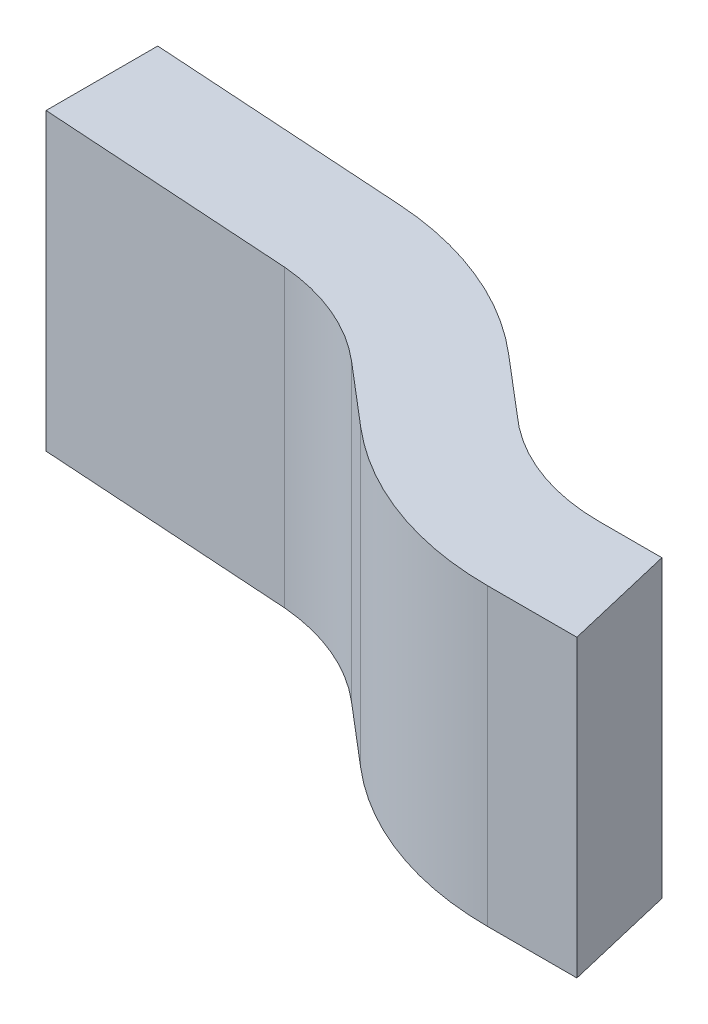
ISO-10303-21;
HEADER;
FILE_DESCRIPTION(('STEP AP214'),'2;1');
FILE_NAME('part.step','',(''),(''),'','','');
FILE_SCHEMA(('AUTOMOTIVE_DESIGN { 1 0 10303 214 1 1 1 1 }'));
ENDSEC;
DATA;
#1=APPLICATION_CONTEXT('core data for automotive mechanical design processes');
#2=APPLICATION_PROTOCOL_DEFINITION('international standard','automotive_design',2000,#1);
#3=PRODUCT_CONTEXT('',#1,'mechanical');
#4=PRODUCT('Part','Part','',(#3));
#5=PRODUCT_RELATED_PRODUCT_CATEGORY('part','',(#4));
#6=PRODUCT_DEFINITION_FORMATION('','',#4);
#7=PRODUCT_DEFINITION_CONTEXT('part definition',#1,'design');
#8=PRODUCT_DEFINITION('design','',#6,#7);
#9=PRODUCT_DEFINITION_SHAPE('','',#8);
#10=(LENGTH_UNIT() NAMED_UNIT(*) SI_UNIT(.MILLI.,.METRE.));
#11=(NAMED_UNIT(*) PLANE_ANGLE_UNIT() SI_UNIT($,.RADIAN.));
#12=(NAMED_UNIT(*) SI_UNIT($,.STERADIAN.) SOLID_ANGLE_UNIT());
#13=UNCERTAINTY_MEASURE_WITH_UNIT(LENGTH_MEASURE(1.E-05),#10,'distance_accuracy_value','');
#14=(GEOMETRIC_REPRESENTATION_CONTEXT(3) GLOBAL_UNCERTAINTY_ASSIGNED_CONTEXT((#13)) GLOBAL_UNIT_ASSIGNED_CONTEXT((#10,
#11,#12)) REPRESENTATION_CONTEXT('',''));
#15=CARTESIAN_POINT('',(0.,0.,0.));
#16=DIRECTION('',(0.,0.,1.));
#17=DIRECTION('',(1.,0.,0.));
#18=AXIS2_PLACEMENT_3D('',#15,#16,#17);
#19=CARTESIAN_POINT('',(22.9050390288176,22.3928286553603,0.580885404323712));
#20=DIRECTION('',(-1.19248805772697E-08,1.,0.));
#21=DIRECTION('',(4.371140912996E-08,0.,-1.));
#22=AXIS2_PLACEMENT_3D('',#19,#20,#21);
#23=PLANE('',#22);
#24=CARTESIAN_POINT('',(22.5906717836576,22.3928286516115,-0.056133579606724));
#25=DIRECTION('',(-1.19248805772697E-08,1.,0.));
#26=DIRECTION('',(4.371140912996E-08,0.,-1.));
#27=AXIS2_PLACEMENT_3D('',#24,#25,#26);
#28=CIRCLE('',#27,0.776782196841);
#29=CARTESIAN_POINT('',(22.5906717497033,22.3928286516115,0.720648617234276));
#30=VERTEX_POINT('',#29);
#31=CARTESIAN_POINT('',(22.0870526892851,22.3928286456059,0.535270164981168));
#32=VERTEX_POINT('',#31);
#33=EDGE_CURVE('E352',#30,#32,#28,.F.);
#34=ORIENTED_EDGE('',*,*,#33,.F.);
#35=DIRECTION('',(-1.,-1.19248805772697E-08,-4.371140912996E-08));
#36=VECTOR('',#35,1.);
#37=CARTESIAN_POINT('',(22.9140262950773,22.3928286554675,0.720648631368558));
#38=LINE('',#37,#36);
#39=CARTESIAN_POINT('',(22.8144929598426,22.3928286542805,0.720596634471796));
#40=VERTEX_POINT('',#39);
#41=EDGE_CURVE('E27',#40,#30,#38,.T.);
#42=ORIENTED_EDGE('',*,*,#41,.F.);
#43=DIRECTION('',(-0.230466341344303,-2.74828361172261E-09,-0.973080297564067));
#44=VECTOR('',#43,1.);
#45=CARTESIAN_POINT('',(22.6840448278391,22.392828652725,0.169815525324744));
#46=LINE('',#45,#44);
#47=CARTESIAN_POINT('',(22.7483331984067,22.3928286534916,0.441255365072879));
#48=VERTEX_POINT('',#47);
#49=EDGE_CURVE('E11',#40,#48,#46,.T.);
#50=ORIENTED_EDGE('',*,*,#49,.T.);
#51=DIRECTION('',(1.,1.19248805772697E-08,4.371140912996E-08));
#52=VECTOR('',#51,1.);
#53=CARTESIAN_POINT('',(22.896051762551,22.3928286552531,0.441255371529866));
#54=LINE('',#53,#52);
#55=CARTESIAN_POINT('',(22.590671761916,22.3928286516115,0.441255358181276));
#56=VERTEX_POINT('',#55);
#57=EDGE_CURVE('E141',#56,#48,#54,.T.);
#58=ORIENTED_EDGE('',*,*,#57,.F.);
#59=CARTESIAN_POINT('',(22.5906717836576,22.3928286516115,-0.056133579606724));
#60=DIRECTION('',(1.19248805772697E-08,-1.,0.));
#61=DIRECTION('',(-1.,-1.19248805772697E-08,-4.37114117457049E-08));
#62=AXIS2_PLACEMENT_3D('',#59,#60,#61);
#63=CIRCLE('',#62,0.497388937788);
#64=CARTESIAN_POINT('',(22.2555025695453,22.3928285476146,0.311479771853922));
#65=VERTEX_POINT('',#64);
#66=EDGE_CURVE('E143',#56,#65,#63,.T.);
#67=ORIENTED_EDGE('',*,*,#66,.T.);
#68=DIRECTION('',(0.761346888968746,9.07897080830686E-09,0.648344749849655));
#69=VECTOR('',#68,1.);
#70=CARTESIAN_POINT('',(22.2553683206918,22.3928286476131,0.3116313669959));
#71=LINE('',#70,#69);
#72=CARTESIAN_POINT('',(22.1132833902313,22.3928286459187,0.190635248102489));
#73=VERTEX_POINT('',#72);
#74=EDGE_CURVE('E181',#73,#65,#71,.T.);
#75=ORIENTED_EDGE('',*,*,#74,.F.);
#76=CARTESIAN_POINT('',(21.6011324511893,22.3928286398113,0.792050658981444));
#77=DIRECTION('',(-1.19248805772697E-08,1.,0.));
#78=DIRECTION('',(4.371140912996E-08,0.,-1.));
#79=AXIS2_PLACEMENT_3D('',#76,#77,#78);
#80=CIRCLE('',#79,0.789936124509);
#81=CARTESIAN_POINT('',(21.651842279257,22.3928286404161,0.00374386962743057));
#82=VERTEX_POINT('',#81);
#83=EDGE_CURVE('E321',#82,#73,#80,.F.);
#84=ORIENTED_EDGE('',*,*,#83,.F.);
#85=DIRECTION('',(0.997937383663776,1.19002841316529E-08,0.0641948462596379));
#86=VECTOR('',#85,1.);
#87=CARTESIAN_POINT('',(21.6444963318866,22.3928286403285,0.00327132298292372));
#88=LINE('',#87,#86);
#89=CARTESIAN_POINT('',(21.0049807259491,22.3928286327024,-0.0378671358781646));
#90=VERTEX_POINT('',#89);
#91=EDGE_CURVE('E320',#90,#82,#88,.T.);
#92=ORIENTED_EDGE('',*,*,#91,.F.);
#93=DIRECTION('',(4.3711408796893E-08,0.,-1.));
#94=VECTOR('',#93,1.);
#95=CARTESIAN_POINT('',(21.0049807198272,22.3928286327024,0.102186134277485));
#96=LINE('',#95,#94);
#97=CARTESIAN_POINT('',(21.0049807137112,22.3928286327024,0.24210482356345));
#98=VERTEX_POINT('',#97);
#99=EDGE_CURVE('E270',#98,#90,#96,.T.);
#100=ORIENTED_EDGE('',*,*,#99,.F.);
#101=DIRECTION('',(-0.997937383663776,-1.19002841316529E-08,-0.0641948462596379));
#102=VECTOR('',#101,1.);
#103=CARTESIAN_POINT('',(21.6444981159939,22.3928286403285,0.283243397978992));
#104=LINE('',#103,#102);
#105=CARTESIAN_POINT('',(21.6444915468946,22.3928285403284,0.28333890376524));
#106=VERTEX_POINT('',#105);
#107=EDGE_CURVE('E335',#106,#98,#104,.T.);
#108=ORIENTED_EDGE('',*,*,#107,.F.);
#109=CARTESIAN_POINT('',(21.6011324511893,22.3928286398113,0.792050658981444));
#110=DIRECTION('',(-1.19248805772697E-08,1.,0.));
#111=DIRECTION('',(4.371140912996E-08,0.,-1.));
#112=AXIS2_PLACEMENT_3D('',#109,#110,#111);
#113=CIRCLE('',#112,0.510541639019);
#114=CARTESIAN_POINT('',(21.9321370995036,22.3928286437585,0.403349375260237));
#115=VERTEX_POINT('',#114);
#116=EDGE_CURVE('E338',#106,#115,#113,.F.);
#117=ORIENTED_EDGE('',*,*,#116,.T.);
#118=DIRECTION('',(-0.761350796906777,-9.07901741000061E-09,-0.648340160756232));
#119=VECTOR('',#118,1.);
#120=CARTESIAN_POINT('',(22.0881045393918,22.3928286456185,0.536165884365783));
#121=LINE('',#120,#119);
#122=EDGE_CURVE('E346',#32,#115,#121,.T.);
#123=ORIENTED_EDGE('',*,*,#122,.F.);
#124=EDGE_LOOP('',(#34,#42,#50,#58,#67,#75,#84,#92,#100,#108,#117,#123));
#125=FACE_BOUND('',#124,.T.);
#126=ADVANCED_FACE('F16',(#125),#23,.T.);
#127=CARTESIAN_POINT('',(22.6840448322512,22.0228286527249,0.169815525324744));
#128=DIRECTION('',(-0.973080297564067,-1.16037722197511E-08,0.230466341344303));
#129=DIRECTION('',(-0.230466341344303,-2.74828361172261E-09,-0.973080297564067));
#130=AXIS2_PLACEMENT_3D('',#127,#128,#129);
#131=PLANE('',#130);
#132=DIRECTION('',(-1.19247838816509E-08,1.,0.));
#133=VECTOR('',#132,1.);
#134=CARTESIAN_POINT('',(22.8145052782766,22.0228286542806,0.720648627018354));
#135=LINE('',#134,#133);
#136=CARTESIAN_POINT('',(22.8144929686671,21.6528286542805,0.720596634471796));
#137=VERTEX_POINT('',#136);
#138=EDGE_CURVE('E149',#137,#40,#135,.T.);
#139=ORIENTED_EDGE('',*,*,#138,.F.);
#140=DIRECTION('',(0.230466341344303,2.74828361172261E-09,0.973080297564067));
#141=VECTOR('',#140,1.);
#142=CARTESIAN_POINT('',(22.748313975252,21.6528286534914,0.441174163367039));
#143=LINE('',#142,#141);
#144=CARTESIAN_POINT('',(22.7483332072311,21.6528286534916,0.441255365072879));
#145=VERTEX_POINT('',#144);
#146=EDGE_CURVE('E146',#145,#137,#143,.T.);
#147=ORIENTED_EDGE('',*,*,#146,.F.);
#148=DIRECTION('',(1.19247838816509E-08,-1.,0.));
#149=VECTOR('',#148,1.);
#150=CARTESIAN_POINT('',(22.7483332028189,22.0228286534915,0.441255365072879));
#151=LINE('',#150,#149);
#152=EDGE_CURVE('E134',#48,#145,#151,.T.);
#153=ORIENTED_EDGE('',*,*,#152,.F.);
#154=ORIENTED_EDGE('',*,*,#49,.F.);
#155=EDGE_LOOP('',(#139,#147,#153,#154));
#156=FACE_BOUND('',#155,.T.);
#157=ADVANCED_FACE('F147',(#156),#131,.F.);
#158=CARTESIAN_POINT('',(22.9140262994895,22.0228286554674,0.720648631368558));
#159=DIRECTION('',(-4.371140912996E-08,0.,1.));
#160=DIRECTION('',(-1.19248806385E-08,1.,0.));
#161=AXIS2_PLACEMENT_3D('',#158,#159,#160);
#162=PLANE('',#161);
#163=DIRECTION('',(-1.19248805772697E-08,1.,0.));
#164=VECTOR('',#163,1.);
#165=CARTESIAN_POINT('',(22.5906717541155,22.0228286516115,0.720648617234276));
#166=LINE('',#165,#164);
#167=CARTESIAN_POINT('',(22.5906717585278,21.6528286516115,0.720648617234276));
#168=VERTEX_POINT('',#167);
#169=EDGE_CURVE('E350',#168,#30,#166,.T.);
#170=ORIENTED_EDGE('',*,*,#169,.F.);
#171=DIRECTION('',(-1.,-1.19248805772697E-08,-4.371140912996E-08));
#172=VECTOR('',#171,1.);
#173=CARTESIAN_POINT('',(22.9050390315328,21.6528286553603,0.720648630975712));
#174=LINE('',#173,#172);
#175=EDGE_CURVE('E154',#137,#168,#174,.T.);
#176=ORIENTED_EDGE('',*,*,#175,.F.);
#177=ORIENTED_EDGE('',*,*,#138,.T.);
#178=ORIENTED_EDGE('',*,*,#41,.T.);
#179=EDGE_LOOP('',(#170,#176,#177,#178));
#180=FACE_BOUND('',#179,.T.);
#181=ADVANCED_FACE('F247',(#180),#162,.T.);
#182=CARTESIAN_POINT('',(22.5906717880698,22.0228286516115,-0.056133579606724));
#183=DIRECTION('',(-1.19248805772697E-08,1.,0.));
#184=DIRECTION('',(-1.,-1.19248805772697E-08,-4.371140912996E-08));
#185=AXIS2_PLACEMENT_3D('',#182,#183,#184);
#186=CYLINDRICAL_SURFACE('',#185,0.776782196841);
#187=DIRECTION('',(-1.19248805772697E-08,1.,0.));
#188=VECTOR('',#187,1.);
#189=CARTESIAN_POINT('',(22.0870526936973,22.0228286456059,0.535270164981168));
#190=LINE('',#189,#188);
#191=CARTESIAN_POINT('',(22.0870526981096,21.6528286456059,0.535270164981168));
#192=VERTEX_POINT('',#191);
#193=EDGE_CURVE('E351',#192,#32,#190,.T.);
#194=ORIENTED_EDGE('',*,*,#193,.F.);
#195=CARTESIAN_POINT('',(22.590671792482,21.6528286516115,-0.056133579606724));
#196=DIRECTION('',(1.19248805772697E-08,-1.,0.));
#197=DIRECTION('',(-1.,-1.19248805772697E-08,-4.371140912996E-08));
#198=AXIS2_PLACEMENT_3D('',#195,#196,#197);
#199=CIRCLE('',#198,0.776782196841);
#200=EDGE_CURVE('E216',#168,#192,#199,.T.);
#201=ORIENTED_EDGE('',*,*,#200,.F.);
#202=ORIENTED_EDGE('',*,*,#169,.T.);
#203=ORIENTED_EDGE('',*,*,#33,.T.);
#204=EDGE_LOOP('',(#194,#201,#202,#203));
#205=FACE_BOUND('',#204,.T.);
#206=ADVANCED_FACE('F244',(#205),#186,.T.);
#207=CARTESIAN_POINT('',(22.0881045438041,22.0228286456184,0.536165884365783));
#208=DIRECTION('',(-0.648340160756232,-7.73137894384814E-09,0.761350796906776));
#209=DIRECTION('',(-0.761350796906776,-9.07901737724629E-09,-0.648340160756232));
#210=AXIS2_PLACEMENT_3D('',#207,#208,#209);
#211=PLANE('',#210);
#212=ORIENTED_EDGE('',*,*,#193,.T.);
#213=ORIENTED_EDGE('',*,*,#122,.T.);
#214=DIRECTION('',(1.19248805772697E-08,-1.,0.));
#215=VECTOR('',#214,1.);
#216=CARTESIAN_POINT('',(21.9321371039158,22.0228286437585,0.403349375260237));
#217=LINE('',#216,#215);
#218=CARTESIAN_POINT('',(21.932137108328,21.6528286437585,0.403349375260237));
#219=VERTEX_POINT('',#218);
#220=EDGE_CURVE('E343',#115,#219,#217,.T.);
#221=ORIENTED_EDGE('',*,*,#220,.T.);
#222=DIRECTION('',(-0.761350796906777,-9.07901741000061E-09,-0.648340160756232));
#223=VECTOR('',#222,1.);
#224=CARTESIAN_POINT('',(22.5837189335071,21.6528286515286,0.958214053932418));
#225=LINE('',#224,#223);
#226=EDGE_CURVE('E213',#192,#219,#225,.T.);
#227=ORIENTED_EDGE('',*,*,#226,.F.);
#228=EDGE_LOOP('',(#212,#213,#221,#227));
#229=FACE_BOUND('',#228,.T.);
#230=ADVANCED_FACE('F18',(#229),#211,.T.);
#231=CARTESIAN_POINT('',(21.6011324556015,22.0228286398113,0.792050658981444));
#232=DIRECTION('',(1.19248805772697E-08,-1.,0.));
#233=DIRECTION('',(1.,1.19248805772697E-08,4.371140912996E-08));
#234=AXIS2_PLACEMENT_3D('',#231,#232,#233);
#235=CYLINDRICAL_SURFACE('',#234,0.510541639019);
#236=ORIENTED_EDGE('',*,*,#116,.F.);
#237=CARTESIAN_POINT('',(21.6444975194674,21.6528286403285,0.283243359038262));
#238=DIRECTION('',(-1.19248799260064E-08,1.,0.));
#239=VECTOR('',#238,1.);
#240=LINE('',#237,#239);
#241=CARTESIAN_POINT('',(21.6444915254006,21.6528286403284,0.283338901813777));
#242=VERTEX_POINT('',#241);
#243=EDGE_CURVE('E224',#242,#106,#240,.T.);
#244=ORIENTED_EDGE('',*,*,#243,.F.);
#245=CARTESIAN_POINT('',(21.6011324600137,21.6528286398114,0.792050658981444));
#246=DIRECTION('',(-1.19248805772697E-08,1.,0.));
#247=DIRECTION('',(1.,1.19248805772697E-08,4.371140912996E-08));
#248=AXIS2_PLACEMENT_3D('',#245,#246,#247);
#249=CIRCLE('',#248,0.510541639019);
#250=EDGE_CURVE('E208',#219,#242,#249,.T.);
#251=ORIENTED_EDGE('',*,*,#250,.F.);
#252=ORIENTED_EDGE('',*,*,#220,.F.);
#253=EDGE_LOOP('',(#236,#244,#251,#252));
#254=FACE_BOUND('',#253,.T.);
#255=ADVANCED_FACE('F231',(#254),#235,.F.);
#256=CARTESIAN_POINT('',(21.6444981204061,22.0228286403285,0.283243397978992));
#257=DIRECTION('',(-0.0641948462596379,-7.65515753114325E-10,0.997937383663776));
#258=DIRECTION('',(-0.997937383663776,-1.19002841848875E-08,-0.0641948462596379));
#259=AXIS2_PLACEMENT_3D('',#256,#257,#258);
#260=PLANE('',#259);
#261=ORIENTED_EDGE('',*,*,#243,.T.);
#262=ORIENTED_EDGE('',*,*,#107,.T.);
#263=DIRECTION('',(-1.19248805772697E-08,1.,0.));
#264=VECTOR('',#263,1.);
#265=CARTESIAN_POINT('',(21.0049807181234,22.0228286327023,0.24210482356345));
#266=LINE('',#265,#264);
#267=CARTESIAN_POINT('',(21.0049807225356,21.6528286327024,0.24210482356345));
#268=VERTEX_POINT('',#267);
#269=EDGE_CURVE('E278',#268,#98,#266,.T.);
#270=ORIENTED_EDGE('',*,*,#269,.F.);
#271=DIRECTION('',(-0.997937383663776,-1.19002841316529E-08,-0.0641948462596379));
#272=VECTOR('',#271,1.);
#273=CARTESIAN_POINT('',(22.9189120481678,21.6528286555258,0.365223296938389));
#274=LINE('',#273,#272);
#275=EDGE_CURVE('E212',#242,#268,#274,.T.);
#276=ORIENTED_EDGE('',*,*,#275,.F.);
#277=EDGE_LOOP('',(#261,#262,#270,#276));
#278=FACE_BOUND('',#277,.T.);
#279=ADVANCED_FACE('F241',(#278),#260,.T.);
#280=CARTESIAN_POINT('',(21.0049807242394,22.0228286327023,0.102186134277485));
#281=DIRECTION('',(-1.,-1.19248805772697E-08,-4.3711408796893E-08));
#282=DIRECTION('',(4.3711408796893E-08,0.,-1.));
#283=AXIS2_PLACEMENT_3D('',#280,#281,#282);
#284=PLANE('',#283);
#285=DIRECTION('',(4.371140912996E-08,0.,-1.));
#286=VECTOR('',#285,1.);
#287=CARTESIAN_POINT('',(21.004980707727,21.6528286327024,0.580885321269485));
#288=LINE('',#287,#286);
#289=CARTESIAN_POINT('',(21.0049807347736,21.6528286327024,-0.0378671358781646));
#290=VERTEX_POINT('',#289);
#291=EDGE_CURVE('E204',#268,#290,#288,.T.);
#292=ORIENTED_EDGE('',*,*,#291,.F.);
#293=ORIENTED_EDGE('',*,*,#269,.T.);
#294=ORIENTED_EDGE('',*,*,#99,.T.);
#295=DIRECTION('',(-1.19248805772697E-08,1.,0.));
#296=VECTOR('',#295,1.);
#297=CARTESIAN_POINT('',(21.0049807303613,22.0228286327023,-0.0378671358781646));
#298=LINE('',#297,#296);
#299=EDGE_CURVE('E308',#290,#90,#298,.T.);
#300=ORIENTED_EDGE('',*,*,#299,.F.);
#301=EDGE_LOOP('',(#292,#293,#294,#300));
#302=FACE_BOUND('',#301,.T.);
#303=ADVANCED_FACE('F242',(#302),#284,.T.);
#304=CARTESIAN_POINT('',(21.6444963362988,22.0228286403285,0.00327132298292372));
#305=DIRECTION('',(0.0641948462596379,7.65515753114325E-10,-0.997937383663776));
#306=DIRECTION('',(0.997937383663776,1.19002841848875E-08,0.0641948462596379));
#307=AXIS2_PLACEMENT_3D('',#304,#305,#306);
#308=PLANE('',#307);
#309=DIRECTION('',(1.19248805772697E-08,-1.,0.));
#310=VECTOR('',#309,1.);
#311=CARTESIAN_POINT('',(21.6518422836693,22.0228286404161,0.00374386962743057));
#312=LINE('',#311,#310);
#313=CARTESIAN_POINT('',(21.6518422880815,21.6528286404161,0.00374386962743057));
#314=VERTEX_POINT('',#313);
#315=EDGE_CURVE('E185',#314,#82,#312,.F.);
#316=ORIENTED_EDGE('',*,*,#315,.F.);
#317=DIRECTION('',(0.997937383663776,1.19002841316529E-08,0.0641948462596379));
#318=VECTOR('',#317,1.);
#319=CARTESIAN_POINT('',(22.9368477342096,21.6528286557396,0.0864050950784113));
#320=LINE('',#319,#318);
#321=EDGE_CURVE('E189',#290,#314,#320,.T.);
#322=ORIENTED_EDGE('',*,*,#321,.F.);
#323=ORIENTED_EDGE('',*,*,#299,.T.);
#324=ORIENTED_EDGE('',*,*,#91,.T.);
#325=EDGE_LOOP('',(#316,#322,#323,#324));
#326=FACE_BOUND('',#325,.T.);
#327=ADVANCED_FACE('F264',(#326),#308,.T.);
#328=CARTESIAN_POINT('',(21.6011324556015,22.0228286398113,0.792050658981444));
#329=DIRECTION('',(1.19248805772697E-08,-1.,0.));
#330=DIRECTION('',(1.,1.19248805772697E-08,4.371140912996E-08));
#331=AXIS2_PLACEMENT_3D('',#328,#329,#330);
#332=CYLINDRICAL_SURFACE('',#331,0.789936124509);
#333=DIRECTION('',(1.19248805772697E-08,-1.,0.));
#334=VECTOR('',#333,1.);
#335=CARTESIAN_POINT('',(22.1132833946435,22.0228286459187,0.190635248102489));
#336=LINE('',#335,#334);
#337=CARTESIAN_POINT('',(22.1132833990557,21.6528286459187,0.190635248102489));
#338=VERTEX_POINT('',#337);
#339=EDGE_CURVE('E173',#338,#73,#336,.F.);
#340=ORIENTED_EDGE('',*,*,#339,.F.);
#341=CARTESIAN_POINT('',(21.6011324600137,21.6528286398114,0.792050658981444));
#342=DIRECTION('',(1.19248805772697E-08,-1.,0.));
#343=DIRECTION('',(1.,1.19248805772697E-08,4.371140912996E-08));
#344=AXIS2_PLACEMENT_3D('',#341,#342,#343);
#345=CIRCLE('',#344,0.789936124509);
#346=EDGE_CURVE('E193',#314,#338,#345,.T.);
#347=ORIENTED_EDGE('',*,*,#346,.F.);
#348=ORIENTED_EDGE('',*,*,#315,.T.);
#349=ORIENTED_EDGE('',*,*,#83,.T.);
#350=EDGE_LOOP('',(#340,#347,#348,#349));
#351=FACE_BOUND('',#350,.T.);
#352=ADVANCED_FACE('F263',(#351),#332,.T.);
#353=CARTESIAN_POINT('',(22.255368325104,22.022828647613,0.3116313669959));
#354=DIRECTION('',(0.648344749849655,7.73143366823941E-09,-0.761346888968746));
#355=DIRECTION('',(0.761346888968746,9.07897077555245E-09,0.648344749849655));
#356=AXIS2_PLACEMENT_3D('',#353,#354,#355);
#357=PLANE('',#356);
#358=CARTESIAN_POINT('',(22.2553725639115,22.3928285476131,0.311634980420098));
#359=DIRECTION('',(1.19248799260065E-08,-1.,0.));
#360=VECTOR('',#359,1.);
#361=LINE('',#358,#360);
#362=CARTESIAN_POINT('',(22.2555027973742,21.6528286476146,0.311479958005621));
#363=VERTEX_POINT('',#362);
#364=EDGE_CURVE('E167',#65,#363,#361,.T.);
#365=ORIENTED_EDGE('',*,*,#364,.T.);
#366=DIRECTION('',(0.761346888968746,9.07897080830686E-09,0.648344749849655));
#367=VECTOR('',#366,1.);
#368=CARTESIAN_POINT('',(22.7648572624328,21.6528286536887,0.745499922248624));
#369=LINE('',#368,#367);
#370=EDGE_CURVE('E191',#338,#363,#369,.T.);
#371=ORIENTED_EDGE('',*,*,#370,.F.);
#372=ORIENTED_EDGE('',*,*,#339,.T.);
#373=ORIENTED_EDGE('',*,*,#74,.T.);
#374=EDGE_LOOP('',(#365,#371,#372,#373));
#375=FACE_BOUND('',#374,.T.);
#376=ADVANCED_FACE('F259',(#375),#357,.T.);
#377=CARTESIAN_POINT('',(22.5906717880698,22.0228286516115,-0.056133579606724));
#378=DIRECTION('',(-1.19248805772697E-08,1.,0.));
#379=DIRECTION('',(-1.,-1.19248805772697E-08,-4.371140912996E-08));
#380=AXIS2_PLACEMENT_3D('',#377,#378,#379);
#381=CYLINDRICAL_SURFACE('',#380,0.497388937788);
#382=ORIENTED_EDGE('',*,*,#66,.F.);
#383=DIRECTION('',(-1.19248805772697E-08,1.,0.));
#384=VECTOR('',#383,1.);
#385=CARTESIAN_POINT('',(22.5906717663282,22.0228286516115,0.441255358181276));
#386=LINE('',#385,#384);
#387=CARTESIAN_POINT('',(22.5906717707404,21.6528286516115,0.441255358181276));
#388=VERTEX_POINT('',#387);
#389=EDGE_CURVE('E128',#388,#56,#386,.T.);
#390=ORIENTED_EDGE('',*,*,#389,.F.);
#391=CARTESIAN_POINT('',(22.590671792482,21.6528286516115,-0.056133579606724));
#392=DIRECTION('',(-1.19248805772697E-08,1.,0.));
#393=DIRECTION('',(-1.,-1.19248805772697E-08,-4.371140912996E-08));
#394=AXIS2_PLACEMENT_3D('',#391,#392,#393);
#395=CIRCLE('',#394,0.497388937788);
#396=EDGE_CURVE('E158',#363,#388,#395,.T.);
#397=ORIENTED_EDGE('',*,*,#396,.F.);
#398=ORIENTED_EDGE('',*,*,#364,.F.);
#399=EDGE_LOOP('',(#382,#390,#397,#398));
#400=FACE_BOUND('',#399,.T.);
#401=ADVANCED_FACE('F258',(#400),#381,.F.);
#402=CARTESIAN_POINT('',(22.8960517669633,22.0228286552531,0.441255371529866));
#403=DIRECTION('',(4.371140912996E-08,0.,-1.));
#404=DIRECTION('',(1.19248806385E-08,-1.,0.));
#405=AXIS2_PLACEMENT_3D('',#402,#403,#404);
#406=PLANE('',#405);
#407=ORIENTED_EDGE('',*,*,#389,.T.);
#408=ORIENTED_EDGE('',*,*,#57,.T.);
#409=ORIENTED_EDGE('',*,*,#152,.T.);
#410=DIRECTION('',(1.,1.19248805772697E-08,4.371140912996E-08));
#411=VECTOR('',#410,1.);
#412=CARTESIAN_POINT('',(22.9050390437455,21.6528286553603,0.441255371922712));
#413=LINE('',#412,#411);
#414=EDGE_CURVE('E138',#388,#145,#413,.T.);
#415=ORIENTED_EDGE('',*,*,#414,.F.);
#416=EDGE_LOOP('',(#407,#408,#409,#415));
#417=FACE_BOUND('',#416,.T.);
#418=ADVANCED_FACE('F136',(#417),#406,.T.);
#419=CARTESIAN_POINT('',(22.905039037642,21.6528286553603,0.580885404323712));
#420=DIRECTION('',(1.19248805772697E-08,-1.,0.));
#421=DIRECTION('',(-4.371140912996E-08,0.,1.));
#422=AXIS2_PLACEMENT_3D('',#419,#420,#421);
#423=PLANE('',#422);
#424=ORIENTED_EDGE('',*,*,#396,.T.);
#425=ORIENTED_EDGE('',*,*,#414,.T.);
#426=ORIENTED_EDGE('',*,*,#146,.T.);
#427=ORIENTED_EDGE('',*,*,#175,.T.);
#428=ORIENTED_EDGE('',*,*,#200,.T.);
#429=ORIENTED_EDGE('',*,*,#226,.T.);
#430=ORIENTED_EDGE('',*,*,#250,.T.);
#431=ORIENTED_EDGE('',*,*,#275,.T.);
#432=ORIENTED_EDGE('',*,*,#291,.T.);
#433=ORIENTED_EDGE('',*,*,#321,.T.);
#434=ORIENTED_EDGE('',*,*,#346,.T.);
#435=ORIENTED_EDGE('',*,*,#370,.T.);
#436=EDGE_LOOP('',(#424,#425,#426,#427,#428,#429,#430,#431,#432,#433,#434,#435));
#437=FACE_BOUND('',#436,.T.);
#438=ADVANCED_FACE('F156',(#437),#423,.T.);
#439=CLOSED_SHELL('',(#126,#157,#181,#206,#230,#255,#279,#303,#327,#352,#376,#401,#418,#438));
#440=MANIFOLD_SOLID_BREP('B1',#439);
#441=ADVANCED_BREP_SHAPE_REPRESENTATION('',(#18,#440),#14);
#442=SHAPE_DEFINITION_REPRESENTATION(#9,#441);
ENDSEC;
END-ISO-10303-21;
